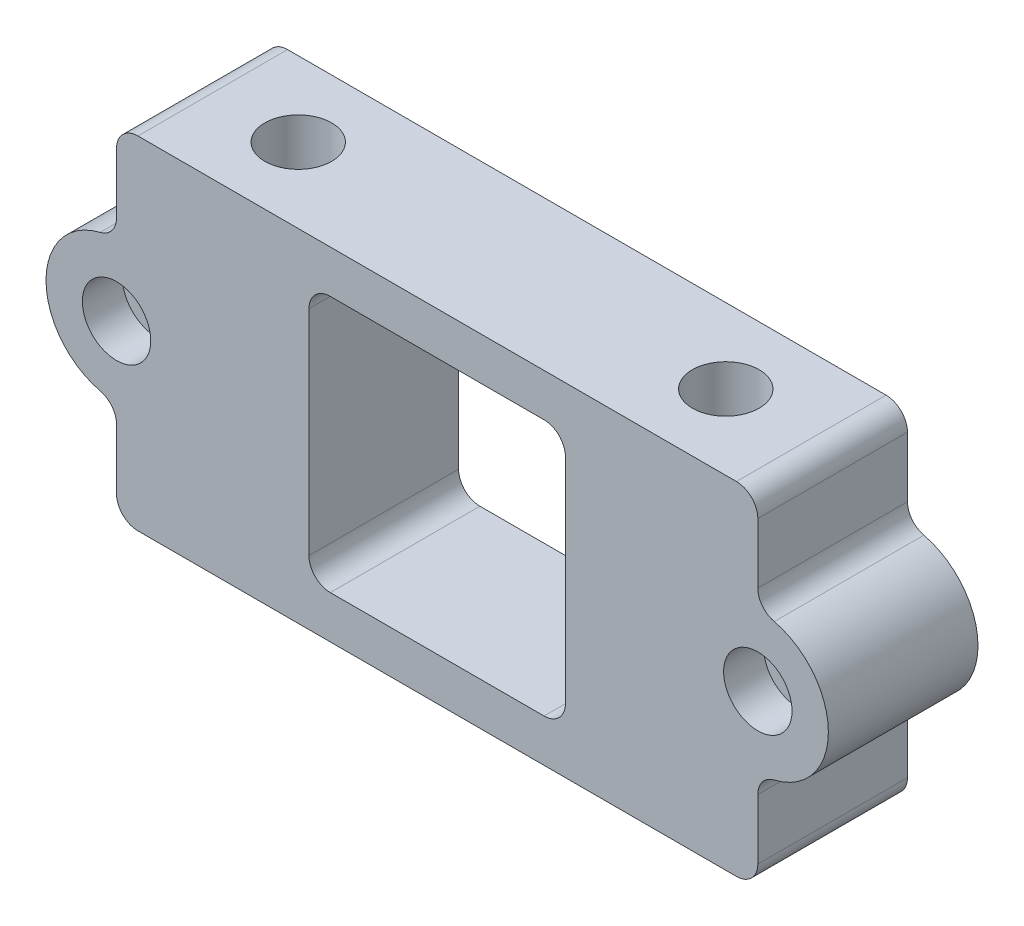
ISO-10303-21;
HEADER;
FILE_DESCRIPTION(('STEP AP214'),'2;1');
FILE_NAME('part.step','',(''),(''),'','','');
FILE_SCHEMA(('AUTOMOTIVE_DESIGN { 1 0 10303 214 1 1 1 1 }'));
ENDSEC;
DATA;
#1=APPLICATION_CONTEXT('core data for automotive mechanical design processes');
#2=APPLICATION_PROTOCOL_DEFINITION('international standard','automotive_design',2000,#1);
#3=PRODUCT_CONTEXT('',#1,'mechanical');
#4=PRODUCT('Part','Part','',(#3));
#5=PRODUCT_RELATED_PRODUCT_CATEGORY('part','',(#4));
#6=PRODUCT_DEFINITION_FORMATION('','',#4);
#7=PRODUCT_DEFINITION_CONTEXT('part definition',#1,'design');
#8=PRODUCT_DEFINITION('design','',#6,#7);
#9=PRODUCT_DEFINITION_SHAPE('','',#8);
#10=(LENGTH_UNIT() NAMED_UNIT(*) SI_UNIT(.MILLI.,.METRE.));
#11=(NAMED_UNIT(*) PLANE_ANGLE_UNIT() SI_UNIT($,.RADIAN.));
#12=(NAMED_UNIT(*) SI_UNIT($,.STERADIAN.) SOLID_ANGLE_UNIT());
#13=UNCERTAINTY_MEASURE_WITH_UNIT(LENGTH_MEASURE(1.E-05),#10,'distance_accuracy_value','');
#14=(GEOMETRIC_REPRESENTATION_CONTEXT(3) GLOBAL_UNCERTAINTY_ASSIGNED_CONTEXT((#13)) GLOBAL_UNIT_ASSIGNED_CONTEXT((#10,
#11,#12)) REPRESENTATION_CONTEXT('',''));
#15=CARTESIAN_POINT('',(0.,0.,0.));
#16=DIRECTION('',(0.,0.,1.));
#17=DIRECTION('',(1.,0.,0.));
#18=AXIS2_PLACEMENT_3D('',#15,#16,#17);
#19=CARTESIAN_POINT('',(-84.93125,0.,-17.78));
#20=DIRECTION('',(0.,0.,1.));
#21=DIRECTION('',(1.,0.,0.));
#22=AXIS2_PLACEMENT_3D('',#19,#20,#21);
#23=CYLINDRICAL_SURFACE('',#22,2.4892);
#24=CARTESIAN_POINT('',(-84.93125,0.,-17.78));
#25=DIRECTION('',(0.,0.,1.));
#26=DIRECTION('',(1.,0.,0.));
#27=AXIS2_PLACEMENT_3D('',#24,#25,#26);
#28=CIRCLE('',#27,2.4892);
#29=CARTESIAN_POINT('',(-82.44205,0.,-17.78));
#30=VERTEX_POINT('',#29);
#31=EDGE_CURVE('E437',#30,#30,#28,.T.);
#32=ORIENTED_EDGE('',*,*,#31,.F.);
#33=EDGE_LOOP('',(#32));
#34=FACE_BOUND('',#33,.T.);
#35=CARTESIAN_POINT('',(-84.93125,0.,-4.7752));
#36=DIRECTION('',(0.,0.,1.));
#37=DIRECTION('',(1.,0.,0.));
#38=AXIS2_PLACEMENT_3D('',#35,#36,#37);
#39=CIRCLE('',#38,2.4892);
#40=CARTESIAN_POINT('',(-82.44205,0.,-4.7752));
#41=VERTEX_POINT('',#40);
#42=EDGE_CURVE('E46',#41,#41,#39,.F.);
#43=ORIENTED_EDGE('',*,*,#42,.F.);
#44=EDGE_LOOP('',(#43));
#45=FACE_BOUND('',#44,.T.);
#46=ADVANCED_FACE('F42',(#34,#45),#23,.F.);
#47=CARTESIAN_POINT('',(-8.73125,0.,-17.78));
#48=DIRECTION('',(0.,0.,1.));
#49=DIRECTION('',(1.,0.,0.));
#50=AXIS2_PLACEMENT_3D('',#47,#48,#49);
#51=CYLINDRICAL_SURFACE('',#50,2.4892);
#52=CARTESIAN_POINT('',(-8.73125,0.,-17.78));
#53=DIRECTION('',(0.,0.,1.));
#54=DIRECTION('',(1.,0.,0.));
#55=AXIS2_PLACEMENT_3D('',#52,#53,#54);
#56=CIRCLE('',#55,2.4892);
#57=CARTESIAN_POINT('',(-6.24204999999999,0.,-17.78));
#58=VERTEX_POINT('',#57);
#59=EDGE_CURVE('E422',#58,#58,#56,.T.);
#60=ORIENTED_EDGE('',*,*,#59,.F.);
#61=EDGE_LOOP('',(#60));
#62=FACE_BOUND('',#61,.T.);
#63=CARTESIAN_POINT('',(-8.73125,0.,-4.7752));
#64=DIRECTION('',(0.,0.,1.));
#65=DIRECTION('',(1.,0.,0.));
#66=AXIS2_PLACEMENT_3D('',#63,#64,#65);
#67=CIRCLE('',#66,2.4892);
#68=CARTESIAN_POINT('',(-6.24204999999999,0.,-4.7752));
#69=VERTEX_POINT('',#68);
#70=EDGE_CURVE('E303',#69,#69,#67,.F.);
#71=ORIENTED_EDGE('',*,*,#70,.F.);
#72=EDGE_LOOP('',(#71));
#73=FACE_BOUND('',#72,.T.);
#74=ADVANCED_FACE('F514',(#62,#73),#51,.F.);
#75=CARTESIAN_POINT('',(-93.6625,20.32,-17.78));
#76=DIRECTION('',(0.,1.,0.));
#77=DIRECTION('',(0.,0.,1.));
#78=AXIS2_PLACEMENT_3D('',#75,#76,#77);
#79=PLANE('',#78);
#80=DIRECTION('',(-1.,0.,0.));
#81=VECTOR('',#80,1.);
#82=CARTESIAN_POINT('',(-93.6625,20.32,0.));
#83=LINE('',#82,#81);
#84=CARTESIAN_POINT('',(-11.27125,20.32,0.));
#85=VERTEX_POINT('',#84);
#86=CARTESIAN_POINT('',(-82.39125,20.32,0.));
#87=VERTEX_POINT('',#86);
#88=EDGE_CURVE('E441',#85,#87,#83,.T.);
#89=ORIENTED_EDGE('',*,*,#88,.F.);
#90=DIRECTION('',(0.,0.,1.));
#91=VECTOR('',#90,1.);
#92=CARTESIAN_POINT('',(-11.27125,20.32,-17.78));
#93=LINE('',#92,#91);
#94=CARTESIAN_POINT('',(-11.27125,20.32,-17.78));
#95=VERTEX_POINT('',#94);
#96=EDGE_CURVE('E499',#85,#95,#93,.F.);
#97=ORIENTED_EDGE('',*,*,#96,.T.);
#98=DIRECTION('',(-1.,0.,0.));
#99=VECTOR('',#98,1.);
#100=CARTESIAN_POINT('',(-93.6625,20.32,-17.78));
#101=LINE('',#100,#99);
#102=CARTESIAN_POINT('',(-82.39125,20.32,-17.78));
#103=VERTEX_POINT('',#102);
#104=EDGE_CURVE('E442',#95,#103,#101,.T.);
#105=ORIENTED_EDGE('',*,*,#104,.T.);
#106=DIRECTION('',(0.,0.,1.));
#107=VECTOR('',#106,1.);
#108=CARTESIAN_POINT('',(-82.39125,20.32,0.));
#109=LINE('',#108,#107);
#110=EDGE_CURVE('E495',#103,#87,#109,.T.);
#111=ORIENTED_EDGE('',*,*,#110,.T.);
#112=EDGE_LOOP('',(#89,#97,#105,#111));
#113=FACE_BOUND('',#112,.T.);
#114=CARTESIAN_POINT('',(-72.23125,20.32,-8.89));
#115=DIRECTION('',(0.,1.,0.));
#116=DIRECTION('',(0.,0.,1.));
#117=AXIS2_PLACEMENT_3D('',#114,#115,#116);
#118=CIRCLE('',#117,3.96874999999999);
#119=CARTESIAN_POINT('',(-72.23125,20.32,-4.92125000000001));
#120=VERTEX_POINT('',#119);
#121=EDGE_CURVE('E423',#120,#120,#118,.T.);
#122=ORIENTED_EDGE('',*,*,#121,.F.);
#123=EDGE_LOOP('',(#122));
#124=FACE_BOUND('',#123,.T.);
#125=CARTESIAN_POINT('',(-21.43125,20.32,-8.89));
#126=DIRECTION('',(0.,1.,0.));
#127=DIRECTION('',(0.,0.,1.));
#128=AXIS2_PLACEMENT_3D('',#125,#126,#127);
#129=CIRCLE('',#128,3.96875);
#130=CARTESIAN_POINT('',(-21.43125,20.32,-4.92125000000001));
#131=VERTEX_POINT('',#130);
#132=EDGE_CURVE('E342',#131,#131,#129,.T.);
#133=ORIENTED_EDGE('',*,*,#132,.F.);
#134=EDGE_LOOP('',(#133));
#135=FACE_BOUND('',#134,.T.);
#136=ADVANCED_FACE('F520',(#113,#124,#135),#79,.T.);
#137=CARTESIAN_POINT('',(-93.6625,-20.32,-17.78));
#138=DIRECTION('',(0.,-1.,0.));
#139=DIRECTION('',(0.,0.,-1.));
#140=AXIS2_PLACEMENT_3D('',#137,#138,#139);
#141=PLANE('',#140);
#142=DIRECTION('',(1.,0.,0.));
#143=VECTOR('',#142,1.);
#144=CARTESIAN_POINT('',(-93.6625,-20.32,-17.78));
#145=LINE('',#144,#143);
#146=CARTESIAN_POINT('',(-82.39125,-20.32,-17.78));
#147=VERTEX_POINT('',#146);
#148=CARTESIAN_POINT('',(-11.2712500000001,-20.32,-17.78));
#149=VERTEX_POINT('',#148);
#150=EDGE_CURVE('E446',#147,#149,#145,.T.);
#151=ORIENTED_EDGE('',*,*,#150,.T.);
#152=DIRECTION('',(0.,0.,1.));
#153=VECTOR('',#152,1.);
#154=CARTESIAN_POINT('',(-11.27125,-20.32,0.));
#155=LINE('',#154,#153);
#156=CARTESIAN_POINT('',(-11.2712500000001,-20.32,0.));
#157=VERTEX_POINT('',#156);
#158=EDGE_CURVE('E460',#149,#157,#155,.T.);
#159=ORIENTED_EDGE('',*,*,#158,.T.);
#160=DIRECTION('',(1.,0.,0.));
#161=VECTOR('',#160,1.);
#162=CARTESIAN_POINT('',(-93.6625,-20.32,0.));
#163=LINE('',#162,#161);
#164=CARTESIAN_POINT('',(-82.39125,-20.32,0.));
#165=VERTEX_POINT('',#164);
#166=EDGE_CURVE('E447',#165,#157,#163,.T.);
#167=ORIENTED_EDGE('',*,*,#166,.F.);
#168=DIRECTION('',(0.,0.,1.));
#169=VECTOR('',#168,1.);
#170=CARTESIAN_POINT('',(-82.39125,-20.32,-17.78));
#171=LINE('',#170,#169);
#172=EDGE_CURVE('E451',#165,#147,#171,.F.);
#173=ORIENTED_EDGE('',*,*,#172,.T.);
#174=EDGE_LOOP('',(#151,#159,#167,#173));
#175=FACE_BOUND('',#174,.T.);
#176=CARTESIAN_POINT('',(-72.23125,-20.32,-8.89));
#177=DIRECTION('',(0.,1.,0.));
#178=DIRECTION('',(0.,0.,1.));
#179=AXIS2_PLACEMENT_3D('',#176,#177,#178);
#180=CIRCLE('',#179,3.96874999999999);
#181=CARTESIAN_POINT('',(-72.23125,-20.32,-4.92125000000001));
#182=VERTEX_POINT('',#181);
#183=EDGE_CURVE('E418',#182,#182,#180,.T.);
#184=ORIENTED_EDGE('',*,*,#183,.T.);
#185=EDGE_LOOP('',(#184));
#186=FACE_BOUND('',#185,.T.);
#187=CARTESIAN_POINT('',(-21.43125,-20.32,-8.89));
#188=DIRECTION('',(0.,1.,0.));
#189=DIRECTION('',(0.,0.,1.));
#190=AXIS2_PLACEMENT_3D('',#187,#188,#189);
#191=CIRCLE('',#190,3.96875);
#192=CARTESIAN_POINT('',(-21.43125,-20.32,-4.92125000000001));
#193=VERTEX_POINT('',#192);
#194=EDGE_CURVE('E427',#193,#193,#191,.T.);
#195=ORIENTED_EDGE('',*,*,#194,.T.);
#196=EDGE_LOOP('',(#195));
#197=FACE_BOUND('',#196,.T.);
#198=ADVANCED_FACE('F529',(#175,#186,#197),#141,.T.);
#199=CARTESIAN_POINT('',(0.,0.,-17.78));
#200=DIRECTION('',(0.,0.,-1.));
#201=DIRECTION('',(-1.,0.,0.));
#202=AXIS2_PLACEMENT_3D('',#199,#200,#201);
#203=PLANE('',#202);
#204=CARTESIAN_POINT('',(-59.53125,-12.7,-17.78));
#205=DIRECTION('',(0.,0.,1.));
#206=DIRECTION('',(-1.,0.,0.));
#207=AXIS2_PLACEMENT_3D('',#204,#205,#206);
#208=CIRCLE('',#207,2.54);
#209=CARTESIAN_POINT('',(-62.07125,-12.7,-17.78));
#210=VERTEX_POINT('',#209);
#211=CARTESIAN_POINT('',(-59.53125,-15.24,-17.78));
#212=VERTEX_POINT('',#211);
#213=EDGE_CURVE('E208',#210,#212,#208,.T.);
#214=ORIENTED_EDGE('',*,*,#213,.T.);
#215=DIRECTION('',(1.,0.,0.));
#216=VECTOR('',#215,1.);
#217=CARTESIAN_POINT('',(-59.53125,-15.24,-17.78));
#218=LINE('',#217,#216);
#219=CARTESIAN_POINT('',(-34.13125,-15.24,-17.78));
#220=VERTEX_POINT('',#219);
#221=EDGE_CURVE('E218',#212,#220,#218,.T.);
#222=ORIENTED_EDGE('',*,*,#221,.T.);
#223=CARTESIAN_POINT('',(-34.13125,-12.7,-17.78));
#224=DIRECTION('',(0.,0.,1.));
#225=DIRECTION('',(1.,0.,0.));
#226=AXIS2_PLACEMENT_3D('',#223,#224,#225);
#227=CIRCLE('',#226,2.54);
#228=CARTESIAN_POINT('',(-31.59125,-12.7,-17.78));
#229=VERTEX_POINT('',#228);
#230=EDGE_CURVE('E60',#220,#229,#227,.T.);
#231=ORIENTED_EDGE('',*,*,#230,.T.);
#232=DIRECTION('',(0.,1.,0.));
#233=VECTOR('',#232,1.);
#234=CARTESIAN_POINT('',(-31.59125,-12.7,-17.78));
#235=LINE('',#234,#233);
#236=CARTESIAN_POINT('',(-31.59125,12.7,-17.78));
#237=VERTEX_POINT('',#236);
#238=EDGE_CURVE('E237',#229,#237,#235,.T.);
#239=ORIENTED_EDGE('',*,*,#238,.T.);
#240=CARTESIAN_POINT('',(-34.13125,12.7,-17.78));
#241=DIRECTION('',(0.,0.,1.));
#242=DIRECTION('',(-1.,0.,0.));
#243=AXIS2_PLACEMENT_3D('',#240,#241,#242);
#244=CIRCLE('',#243,2.54);
#245=CARTESIAN_POINT('',(-34.13125,15.24,-17.78));
#246=VERTEX_POINT('',#245);
#247=EDGE_CURVE('E241',#237,#246,#244,.T.);
#248=ORIENTED_EDGE('',*,*,#247,.T.);
#249=DIRECTION('',(-1.,0.,0.));
#250=VECTOR('',#249,1.);
#251=CARTESIAN_POINT('',(-59.53125,15.24,-17.78));
#252=LINE('',#251,#250);
#253=CARTESIAN_POINT('',(-59.53125,15.24,-17.78));
#254=VERTEX_POINT('',#253);
#255=EDGE_CURVE('E245',#246,#254,#252,.T.);
#256=ORIENTED_EDGE('',*,*,#255,.T.);
#257=CARTESIAN_POINT('',(-59.53125,12.7,-17.78));
#258=DIRECTION('',(0.,0.,1.));
#259=DIRECTION('',(-1.,0.,0.));
#260=AXIS2_PLACEMENT_3D('',#257,#258,#259);
#261=CIRCLE('',#260,2.54);
#262=CARTESIAN_POINT('',(-62.07125,12.7,-17.78));
#263=VERTEX_POINT('',#262);
#264=EDGE_CURVE('E249',#254,#263,#261,.T.);
#265=ORIENTED_EDGE('',*,*,#264,.T.);
#266=DIRECTION('',(0.,-1.,0.));
#267=VECTOR('',#266,1.);
#268=CARTESIAN_POINT('',(-62.07125,-12.7,-17.78));
#269=LINE('',#268,#267);
#270=EDGE_CURVE('E215',#263,#210,#269,.T.);
#271=ORIENTED_EDGE('',*,*,#270,.T.);
#272=EDGE_LOOP('',(#214,#222,#231,#239,#248,#256,#265,#271));
#273=FACE_BOUND('',#272,.T.);
#274=DIRECTION('',(0.,-1.,0.));
#275=VECTOR('',#274,1.);
#276=CARTESIAN_POINT('',(-8.73125000000001,-10.6225460224938,-17.78));
#277=LINE('',#276,#275);
#278=CARTESIAN_POINT('',(-8.73125,-10.6225460224938,-17.78));
#279=VERTEX_POINT('',#278);
#280=CARTESIAN_POINT('',(-8.73125000000004,-17.78,-17.78));
#281=VERTEX_POINT('',#280);
#282=EDGE_CURVE('E334',#279,#281,#277,.T.);
#283=ORIENTED_EDGE('',*,*,#282,.T.);
#284=CARTESIAN_POINT('',(-11.27125,-17.78,-17.78));
#285=DIRECTION('',(0.,0.,-1.));
#286=DIRECTION('',(-1.,0.,0.));
#287=AXIS2_PLACEMENT_3D('',#284,#285,#286);
#288=CIRCLE('',#287,2.54);
#289=EDGE_CURVE('E488',#281,#149,#288,.T.);
#290=ORIENTED_EDGE('',*,*,#289,.T.);
#291=ORIENTED_EDGE('',*,*,#150,.F.);
#292=CARTESIAN_POINT('',(-82.39125,-17.78,-17.78));
#293=DIRECTION('',(0.,0.,-1.));
#294=DIRECTION('',(-1.,0.,0.));
#295=AXIS2_PLACEMENT_3D('',#292,#293,#294);
#296=CIRCLE('',#295,2.54);
#297=CARTESIAN_POINT('',(-84.93125,-17.78,-17.78));
#298=VERTEX_POINT('',#297);
#299=EDGE_CURVE('E479',#147,#298,#296,.T.);
#300=ORIENTED_EDGE('',*,*,#299,.T.);
#301=DIRECTION('',(0.,1.,0.));
#302=VECTOR('',#301,1.);
#303=CARTESIAN_POINT('',(-84.93125,-10.6225460224939,-17.78));
#304=LINE('',#303,#302);
#305=CARTESIAN_POINT('',(-84.93125,-10.6225460224939,-17.78));
#306=VERTEX_POINT('',#305);
#307=EDGE_CURVE('E319',#298,#306,#304,.T.);
#308=ORIENTED_EDGE('',*,*,#307,.T.);
#309=CARTESIAN_POINT('',(-87.47125,-10.6225460224939,-17.78));
#310=DIRECTION('',(0.,0.,-1.));
#311=DIRECTION('',(-1.,0.,0.));
#312=AXIS2_PLACEMENT_3D('',#309,#310,#311);
#313=CIRCLE('',#312,2.54000000000001);
#314=CARTESIAN_POINT('',(-86.8805523255814,-8.152186482379,-17.78));
#315=VERTEX_POINT('',#314);
#316=EDGE_CURVE('E354',#306,#315,#313,.F.);
#317=ORIENTED_EDGE('',*,*,#316,.T.);
#318=CARTESIAN_POINT('',(-84.93125,0.,-17.78));
#319=DIRECTION('',(0.,0.,-1.));
#320=DIRECTION('',(-1.,0.,0.));
#321=AXIS2_PLACEMENT_3D('',#318,#319,#320);
#322=CIRCLE('',#321,8.382);
#323=CARTESIAN_POINT('',(-86.8805523255814,8.152186482379,-17.78));
#324=VERTEX_POINT('',#323);
#325=EDGE_CURVE('E349',#315,#324,#322,.T.);
#326=ORIENTED_EDGE('',*,*,#325,.T.);
#327=CARTESIAN_POINT('',(-87.47125,10.6225460224939,-17.78));
#328=DIRECTION('',(0.,0.,-1.));
#329=DIRECTION('',(-1.,0.,0.));
#330=AXIS2_PLACEMENT_3D('',#327,#328,#329);
#331=CIRCLE('',#330,2.54000000000001);
#332=CARTESIAN_POINT('',(-84.93125,10.6225460224939,-17.78));
#333=VERTEX_POINT('',#332);
#334=EDGE_CURVE('E344',#324,#333,#331,.F.);
#335=ORIENTED_EDGE('',*,*,#334,.T.);
#336=DIRECTION('',(0.,1.,0.));
#337=VECTOR('',#336,1.);
#338=CARTESIAN_POINT('',(-84.93125,10.6225460224939,-17.78));
#339=LINE('',#338,#337);
#340=CARTESIAN_POINT('',(-84.93125,17.78,-17.78));
#341=VERTEX_POINT('',#340);
#342=EDGE_CURVE('E338',#333,#341,#339,.T.);
#343=ORIENTED_EDGE('',*,*,#342,.T.);
#344=CARTESIAN_POINT('',(-82.39125,17.78,-17.78));
#345=DIRECTION('',(0.,0.,-1.));
#346=DIRECTION('',(-1.,0.,0.));
#347=AXIS2_PLACEMENT_3D('',#344,#345,#346);
#348=CIRCLE('',#347,2.54);
#349=EDGE_CURVE('E482',#341,#103,#348,.T.);
#350=ORIENTED_EDGE('',*,*,#349,.T.);
#351=ORIENTED_EDGE('',*,*,#104,.F.);
#352=CARTESIAN_POINT('',(-11.27125,17.78,-17.78));
#353=DIRECTION('',(0.,0.,-1.));
#354=DIRECTION('',(-1.,0.,0.));
#355=AXIS2_PLACEMENT_3D('',#352,#353,#354);
#356=CIRCLE('',#355,2.54);
#357=CARTESIAN_POINT('',(-8.73124999999999,17.78,-17.78));
#358=VERTEX_POINT('',#357);
#359=EDGE_CURVE('E485',#95,#358,#356,.T.);
#360=ORIENTED_EDGE('',*,*,#359,.T.);
#361=DIRECTION('',(0.,-1.,0.));
#362=VECTOR('',#361,1.);
#363=CARTESIAN_POINT('',(-8.73124999999998,10.6225460224939,-17.78));
#364=LINE('',#363,#362);
#365=CARTESIAN_POINT('',(-8.73124999999998,10.6225460224939,-17.78));
#366=VERTEX_POINT('',#365);
#367=EDGE_CURVE('E372',#358,#366,#364,.T.);
#368=ORIENTED_EDGE('',*,*,#367,.T.);
#369=CARTESIAN_POINT('',(-6.19124999999997,10.6225460224939,-17.78));
#370=DIRECTION('',(0.,0.,-1.));
#371=DIRECTION('',(-1.,0.,0.));
#372=AXIS2_PLACEMENT_3D('',#369,#370,#371);
#373=CIRCLE('',#372,2.54000000000001);
#374=CARTESIAN_POINT('',(-6.78194767441858,8.15218648237901,-17.78));
#375=VERTEX_POINT('',#374);
#376=EDGE_CURVE('E401',#366,#375,#373,.F.);
#377=ORIENTED_EDGE('',*,*,#376,.T.);
#378=CARTESIAN_POINT('',(-8.73125,0.,-17.78));
#379=DIRECTION('',(0.,0.,-1.));
#380=DIRECTION('',(-1.,0.,0.));
#381=AXIS2_PLACEMENT_3D('',#378,#379,#380);
#382=CIRCLE('',#381,8.382);
#383=CARTESIAN_POINT('',(-6.7819476744186,-8.152186482379,-17.78));
#384=VERTEX_POINT('',#383);
#385=EDGE_CURVE('E396',#375,#384,#382,.T.);
#386=ORIENTED_EDGE('',*,*,#385,.T.);
#387=CARTESIAN_POINT('',(-6.19125,-10.6225460224938,-17.78));
#388=DIRECTION('',(0.,0.,-1.));
#389=DIRECTION('',(-1.,0.,0.));
#390=AXIS2_PLACEMENT_3D('',#387,#388,#389);
#391=CIRCLE('',#390,2.54000000000001);
#392=EDGE_CURVE('E391',#384,#279,#391,.F.);
#393=ORIENTED_EDGE('',*,*,#392,.T.);
#394=EDGE_LOOP('',(#283,#290,#291,#300,#308,#317,#326,#335,#343,#350,#351,#360,#368,#377,#386,#393));
#395=FACE_BOUND('',#394,.T.);
#396=ORIENTED_EDGE('',*,*,#59,.T.);
#397=EDGE_LOOP('',(#396));
#398=FACE_BOUND('',#397,.T.);
#399=ORIENTED_EDGE('',*,*,#31,.T.);
#400=EDGE_LOOP('',(#399));
#401=FACE_BOUND('',#400,.T.);
#402=ADVANCED_FACE('F223',(#273,#395,#398,#401),#203,.T.);
#403=CARTESIAN_POINT('',(0.,0.,0.));
#404=DIRECTION('',(0.,0.,-1.));
#405=DIRECTION('',(-1.,0.,0.));
#406=AXIS2_PLACEMENT_3D('',#403,#404,#405);
#407=PLANE('',#406);
#408=DIRECTION('',(1.,0.,0.));
#409=VECTOR('',#408,1.);
#410=CARTESIAN_POINT('',(-59.53125,-15.24,0.));
#411=LINE('',#410,#409);
#412=CARTESIAN_POINT('',(-59.53125,-15.24,0.));
#413=VERTEX_POINT('',#412);
#414=CARTESIAN_POINT('',(-34.13125,-15.24,0.));
#415=VERTEX_POINT('',#414);
#416=EDGE_CURVE('E256',#413,#415,#411,.T.);
#417=ORIENTED_EDGE('',*,*,#416,.F.);
#418=CARTESIAN_POINT('',(-59.53125,-12.7,0.));
#419=DIRECTION('',(0.,0.,1.));
#420=DIRECTION('',(-1.,0.,0.));
#421=AXIS2_PLACEMENT_3D('',#418,#419,#420);
#422=CIRCLE('',#421,2.54);
#423=CARTESIAN_POINT('',(-62.07125,-12.7,0.));
#424=VERTEX_POINT('',#423);
#425=EDGE_CURVE('E68',#424,#413,#422,.T.);
#426=ORIENTED_EDGE('',*,*,#425,.F.);
#427=DIRECTION('',(0.,-1.,0.));
#428=VECTOR('',#427,1.);
#429=CARTESIAN_POINT('',(-62.07125,-12.7,0.));
#430=LINE('',#429,#428);
#431=CARTESIAN_POINT('',(-62.07125,12.7,0.));
#432=VERTEX_POINT('',#431);
#433=EDGE_CURVE('E228',#432,#424,#430,.T.);
#434=ORIENTED_EDGE('',*,*,#433,.F.);
#435=CARTESIAN_POINT('',(-59.53125,12.7,0.));
#436=DIRECTION('',(0.,0.,1.));
#437=DIRECTION('',(-1.,0.,0.));
#438=AXIS2_PLACEMENT_3D('',#435,#436,#437);
#439=CIRCLE('',#438,2.54);
#440=CARTESIAN_POINT('',(-59.53125,15.24,0.));
#441=VERTEX_POINT('',#440);
#442=EDGE_CURVE('E232',#441,#432,#439,.T.);
#443=ORIENTED_EDGE('',*,*,#442,.F.);
#444=DIRECTION('',(-1.,0.,0.));
#445=VECTOR('',#444,1.);
#446=CARTESIAN_POINT('',(-59.53125,15.24,0.));
#447=LINE('',#446,#445);
#448=CARTESIAN_POINT('',(-34.13125,15.24,0.));
#449=VERTEX_POINT('',#448);
#450=EDGE_CURVE('E271',#449,#441,#447,.T.);
#451=ORIENTED_EDGE('',*,*,#450,.F.);
#452=CARTESIAN_POINT('',(-34.13125,12.7,0.));
#453=DIRECTION('',(0.,0.,1.));
#454=DIRECTION('',(-1.,0.,0.));
#455=AXIS2_PLACEMENT_3D('',#452,#453,#454);
#456=CIRCLE('',#455,2.54);
#457=CARTESIAN_POINT('',(-31.59125,12.7,0.));
#458=VERTEX_POINT('',#457);
#459=EDGE_CURVE('E267',#458,#449,#456,.T.);
#460=ORIENTED_EDGE('',*,*,#459,.F.);
#461=DIRECTION('',(0.,1.,0.));
#462=VECTOR('',#461,1.);
#463=CARTESIAN_POINT('',(-31.59125,-12.7,0.));
#464=LINE('',#463,#462);
#465=CARTESIAN_POINT('',(-31.59125,-12.7,0.));
#466=VERTEX_POINT('',#465);
#467=EDGE_CURVE('E263',#466,#458,#464,.T.);
#468=ORIENTED_EDGE('',*,*,#467,.F.);
#469=CARTESIAN_POINT('',(-34.13125,-12.7,0.));
#470=DIRECTION('',(0.,0.,1.));
#471=DIRECTION('',(1.,0.,0.));
#472=AXIS2_PLACEMENT_3D('',#469,#470,#471);
#473=CIRCLE('',#472,2.54);
#474=EDGE_CURVE('E259',#415,#466,#473,.T.);
#475=ORIENTED_EDGE('',*,*,#474,.F.);
#476=EDGE_LOOP('',(#417,#426,#434,#443,#451,#460,#468,#475));
#477=FACE_BOUND('',#476,.T.);
#478=CARTESIAN_POINT('',(-8.73125,0.,0.));
#479=DIRECTION('',(0.,0.,1.));
#480=DIRECTION('',(1.,0.,0.));
#481=AXIS2_PLACEMENT_3D('',#478,#479,#480);
#482=CIRCLE('',#481,4.06400000000002);
#483=CARTESIAN_POINT('',(-4.66724999999998,0.,0.));
#484=VERTEX_POINT('',#483);
#485=EDGE_CURVE('E304',#484,#484,#482,.T.);
#486=ORIENTED_EDGE('',*,*,#485,.F.);
#487=EDGE_LOOP('',(#486));
#488=FACE_BOUND('',#487,.T.);
#489=CARTESIAN_POINT('',(-84.93125,0.,0.));
#490=DIRECTION('',(0.,0.,1.));
#491=DIRECTION('',(1.,0.,0.));
#492=AXIS2_PLACEMENT_3D('',#489,#490,#491);
#493=CIRCLE('',#492,4.06400000000002);
#494=CARTESIAN_POINT('',(-80.86725,0.,0.));
#495=VERTEX_POINT('',#494);
#496=EDGE_CURVE('E281',#495,#495,#493,.T.);
#497=ORIENTED_EDGE('',*,*,#496,.F.);
#498=EDGE_LOOP('',(#497));
#499=FACE_BOUND('',#498,.T.);
#500=ORIENTED_EDGE('',*,*,#166,.T.);
#501=CARTESIAN_POINT('',(-11.27125,-17.78,0.));
#502=DIRECTION('',(0.,0.,-1.));
#503=DIRECTION('',(-1.,0.,0.));
#504=AXIS2_PLACEMENT_3D('',#501,#502,#503);
#505=CIRCLE('',#504,2.54);
#506=CARTESIAN_POINT('',(-8.73125000000004,-17.78,0.));
#507=VERTEX_POINT('',#506);
#508=EDGE_CURVE('E473',#157,#507,#505,.F.);
#509=ORIENTED_EDGE('',*,*,#508,.T.);
#510=DIRECTION('',(0.,-1.,0.));
#511=VECTOR('',#510,1.);
#512=CARTESIAN_POINT('',(-8.73125000000001,-10.6225460224938,0.));
#513=LINE('',#512,#511);
#514=CARTESIAN_POINT('',(-8.73125000000001,-10.6225460224938,0.));
#515=VERTEX_POINT('',#514);
#516=EDGE_CURVE('E368',#515,#507,#513,.T.);
#517=ORIENTED_EDGE('',*,*,#516,.F.);
#518=CARTESIAN_POINT('',(-6.19125,-10.6225460224938,0.));
#519=DIRECTION('',(0.,0.,1.));
#520=DIRECTION('',(-1.,0.,0.));
#521=AXIS2_PLACEMENT_3D('',#518,#519,#520);
#522=CIRCLE('',#521,2.54000000000001);
#523=CARTESIAN_POINT('',(-6.7819476744186,-8.152186482379,0.));
#524=VERTEX_POINT('',#523);
#525=EDGE_CURVE('E373',#524,#515,#522,.T.);
#526=ORIENTED_EDGE('',*,*,#525,.F.);
#527=CARTESIAN_POINT('',(-8.73125,0.,0.));
#528=DIRECTION('',(0.,0.,-1.));
#529=DIRECTION('',(-1.,0.,0.));
#530=AXIS2_PLACEMENT_3D('',#527,#528,#529);
#531=CIRCLE('',#530,8.382);
#532=CARTESIAN_POINT('',(-6.78194767441858,8.15218648237901,0.));
#533=VERTEX_POINT('',#532);
#534=EDGE_CURVE('E376',#533,#524,#531,.T.);
#535=ORIENTED_EDGE('',*,*,#534,.F.);
#536=CARTESIAN_POINT('',(-6.19124999999997,10.6225460224939,0.));
#537=DIRECTION('',(0.,0.,1.));
#538=DIRECTION('',(1.,0.,0.));
#539=AXIS2_PLACEMENT_3D('',#536,#537,#538);
#540=CIRCLE('',#539,2.54000000000001);
#541=CARTESIAN_POINT('',(-8.73124999999998,10.6225460224939,0.));
#542=VERTEX_POINT('',#541);
#543=EDGE_CURVE('E380',#542,#533,#540,.T.);
#544=ORIENTED_EDGE('',*,*,#543,.F.);
#545=DIRECTION('',(0.,-1.,0.));
#546=VECTOR('',#545,1.);
#547=CARTESIAN_POINT('',(-8.73124999999998,10.6225460224939,0.));
#548=LINE('',#547,#546);
#549=CARTESIAN_POINT('',(-8.73124999999999,17.78,0.));
#550=VERTEX_POINT('',#549);
#551=EDGE_CURVE('E384',#550,#542,#548,.T.);
#552=ORIENTED_EDGE('',*,*,#551,.F.);
#553=CARTESIAN_POINT('',(-11.27125,17.78,0.));
#554=DIRECTION('',(0.,0.,-1.));
#555=DIRECTION('',(-1.,0.,0.));
#556=AXIS2_PLACEMENT_3D('',#553,#554,#555);
#557=CIRCLE('',#556,2.54);
#558=EDGE_CURVE('E470',#550,#85,#557,.F.);
#559=ORIENTED_EDGE('',*,*,#558,.T.);
#560=ORIENTED_EDGE('',*,*,#88,.T.);
#561=CARTESIAN_POINT('',(-82.39125,17.78,0.));
#562=DIRECTION('',(0.,0.,-1.));
#563=DIRECTION('',(-1.,0.,0.));
#564=AXIS2_PLACEMENT_3D('',#561,#562,#563);
#565=CIRCLE('',#564,2.54);
#566=CARTESIAN_POINT('',(-84.93125,17.78,0.));
#567=VERTEX_POINT('',#566);
#568=EDGE_CURVE('E467',#87,#567,#565,.F.);
#569=ORIENTED_EDGE('',*,*,#568,.T.);
#570=DIRECTION('',(0.,1.,0.));
#571=VECTOR('',#570,1.);
#572=CARTESIAN_POINT('',(-84.93125,10.6225460224939,0.));
#573=LINE('',#572,#571);
#574=CARTESIAN_POINT('',(-84.93125,10.6225460224939,0.));
#575=VERTEX_POINT('',#574);
#576=EDGE_CURVE('E315',#575,#567,#573,.T.);
#577=ORIENTED_EDGE('',*,*,#576,.F.);
#578=CARTESIAN_POINT('',(-87.47125,10.6225460224939,0.));
#579=DIRECTION('',(0.,0.,1.));
#580=DIRECTION('',(-1.,0.,0.));
#581=AXIS2_PLACEMENT_3D('',#578,#579,#580);
#582=CIRCLE('',#581,2.54000000000001);
#583=CARTESIAN_POINT('',(-86.8805523255814,8.152186482379,0.));
#584=VERTEX_POINT('',#583);
#585=EDGE_CURVE('E320',#584,#575,#582,.T.);
#586=ORIENTED_EDGE('',*,*,#585,.F.);
#587=CARTESIAN_POINT('',(-84.93125,0.,0.));
#588=DIRECTION('',(0.,0.,-1.));
#589=DIRECTION('',(1.,0.,0.));
#590=AXIS2_PLACEMENT_3D('',#587,#588,#589);
#591=CIRCLE('',#590,8.382);
#592=CARTESIAN_POINT('',(-86.8805523255814,-8.152186482379,0.));
#593=VERTEX_POINT('',#592);
#594=EDGE_CURVE('E323',#593,#584,#591,.T.);
#595=ORIENTED_EDGE('',*,*,#594,.F.);
#596=CARTESIAN_POINT('',(-87.47125,-10.6225460224939,0.));
#597=DIRECTION('',(0.,0.,1.));
#598=DIRECTION('',(1.,0.,0.));
#599=AXIS2_PLACEMENT_3D('',#596,#597,#598);
#600=CIRCLE('',#599,2.54000000000001);
#601=CARTESIAN_POINT('',(-84.93125,-10.6225460224939,0.));
#602=VERTEX_POINT('',#601);
#603=EDGE_CURVE('E327',#602,#593,#600,.T.);
#604=ORIENTED_EDGE('',*,*,#603,.F.);
#605=DIRECTION('',(0.,1.,0.));
#606=VECTOR('',#605,1.);
#607=CARTESIAN_POINT('',(-84.93125,-10.6225460224939,0.));
#608=LINE('',#607,#606);
#609=CARTESIAN_POINT('',(-84.93125,-17.78,0.));
#610=VERTEX_POINT('',#609);
#611=EDGE_CURVE('E331',#610,#602,#608,.T.);
#612=ORIENTED_EDGE('',*,*,#611,.F.);
#613=CARTESIAN_POINT('',(-82.39125,-17.78,0.));
#614=DIRECTION('',(0.,0.,-1.));
#615=DIRECTION('',(-1.,0.,0.));
#616=AXIS2_PLACEMENT_3D('',#613,#614,#615);
#617=CIRCLE('',#616,2.54);
#618=EDGE_CURVE('E464',#610,#165,#617,.F.);
#619=ORIENTED_EDGE('',*,*,#618,.T.);
#620=EDGE_LOOP('',(#500,#509,#517,#526,#535,#544,#552,#559,#560,#569,#577,#586,#595,#604,#612,#619));
#621=FACE_BOUND('',#620,.T.);
#622=ADVANCED_FACE('F528',(#477,#488,#499,#621),#407,.F.);
#623=CARTESIAN_POINT('',(-21.43125,-20.32,-8.89));
#624=DIRECTION('',(0.,1.,0.));
#625=DIRECTION('',(0.,0.,1.));
#626=AXIS2_PLACEMENT_3D('',#623,#624,#625);
#627=CYLINDRICAL_SURFACE('',#626,3.96875);
#628=ORIENTED_EDGE('',*,*,#194,.F.);
#629=EDGE_LOOP('',(#628));
#630=FACE_BOUND('',#629,.T.);
#631=ORIENTED_EDGE('',*,*,#132,.T.);
#632=EDGE_LOOP('',(#631));
#633=FACE_BOUND('',#632,.T.);
#634=ADVANCED_FACE('F532',(#630,#633),#627,.F.);
#635=CARTESIAN_POINT('',(-72.23125,-20.32,-8.89));
#636=DIRECTION('',(0.,1.,0.));
#637=DIRECTION('',(0.,0.,1.));
#638=AXIS2_PLACEMENT_3D('',#635,#636,#637);
#639=CYLINDRICAL_SURFACE('',#638,3.96874999999999);
#640=ORIENTED_EDGE('',*,*,#183,.F.);
#641=EDGE_LOOP('',(#640));
#642=FACE_BOUND('',#641,.T.);
#643=ORIENTED_EDGE('',*,*,#121,.T.);
#644=EDGE_LOOP('',(#643));
#645=FACE_BOUND('',#644,.T.);
#646=ADVANCED_FACE('F643',(#642,#645),#639,.F.);
#647=CARTESIAN_POINT('',(-8.73124999999998,10.6225460224939,-59.3473468790409));
#648=DIRECTION('',(-1.,0.,0.));
#649=DIRECTION('',(0.,-1.,0.));
#650=AXIS2_PLACEMENT_3D('',#647,#648,#649);
#651=PLANE('',#650);
#652=ORIENTED_EDGE('',*,*,#367,.F.);
#653=DIRECTION('',(0.,0.,1.));
#654=VECTOR('',#653,1.);
#655=CARTESIAN_POINT('',(-8.73124999999999,17.78,0.));
#656=LINE('',#655,#654);
#657=EDGE_CURVE('E491',#358,#550,#656,.T.);
#658=ORIENTED_EDGE('',*,*,#657,.T.);
#659=ORIENTED_EDGE('',*,*,#551,.T.);
#660=DIRECTION('',(0.,0.,1.));
#661=VECTOR('',#660,1.);
#662=CARTESIAN_POINT('',(-8.73124999999998,10.6225460224939,-59.3473468790409));
#663=LINE('',#662,#661);
#664=EDGE_CURVE('E405',#366,#542,#663,.T.);
#665=ORIENTED_EDGE('',*,*,#664,.F.);
#666=EDGE_LOOP('',(#652,#658,#659,#665));
#667=FACE_BOUND('',#666,.T.);
#668=ADVANCED_FACE('F570',(#667),#651,.F.);
#669=CARTESIAN_POINT('',(-6.19124999999997,10.6225460224939,-59.3473468790409));
#670=DIRECTION('',(0.,0.,1.));
#671=DIRECTION('',(1.,0.,0.));
#672=AXIS2_PLACEMENT_3D('',#669,#670,#671);
#673=CYLINDRICAL_SURFACE('',#672,2.54000000000001);
#674=ORIENTED_EDGE('',*,*,#664,.T.);
#675=ORIENTED_EDGE('',*,*,#543,.T.);
#676=DIRECTION('',(0.,0.,1.));
#677=VECTOR('',#676,1.);
#678=CARTESIAN_POINT('',(-6.78194767441858,8.15218648237901,-59.3473468790409));
#679=LINE('',#678,#677);
#680=EDGE_CURVE('E400',#375,#533,#679,.T.);
#681=ORIENTED_EDGE('',*,*,#680,.F.);
#682=ORIENTED_EDGE('',*,*,#376,.F.);
#683=EDGE_LOOP('',(#674,#675,#681,#682));
#684=FACE_BOUND('',#683,.T.);
#685=ADVANCED_FACE('F574',(#684),#673,.F.);
#686=CARTESIAN_POINT('',(-8.73125,0.,-59.3473468790409));
#687=DIRECTION('',(0.,0.,1.));
#688=DIRECTION('',(1.,0.,0.));
#689=AXIS2_PLACEMENT_3D('',#686,#687,#688);
#690=CYLINDRICAL_SURFACE('',#689,8.382);
#691=ORIENTED_EDGE('',*,*,#680,.T.);
#692=ORIENTED_EDGE('',*,*,#534,.T.);
#693=DIRECTION('',(0.,0.,1.));
#694=VECTOR('',#693,1.);
#695=CARTESIAN_POINT('',(-6.7819476744186,-8.152186482379,-59.3473468790409));
#696=LINE('',#695,#694);
#697=EDGE_CURVE('E395',#384,#524,#696,.T.);
#698=ORIENTED_EDGE('',*,*,#697,.F.);
#699=ORIENTED_EDGE('',*,*,#385,.F.);
#700=EDGE_LOOP('',(#691,#692,#698,#699));
#701=FACE_BOUND('',#700,.T.);
#702=ADVANCED_FACE('F582',(#701),#690,.T.);
#703=CARTESIAN_POINT('',(-6.19125,-10.6225460224938,-59.3473468790409));
#704=DIRECTION('',(0.,0.,1.));
#705=DIRECTION('',(1.,0.,0.));
#706=AXIS2_PLACEMENT_3D('',#703,#704,#705);
#707=CYLINDRICAL_SURFACE('',#706,2.54000000000001);
#708=ORIENTED_EDGE('',*,*,#697,.T.);
#709=ORIENTED_EDGE('',*,*,#525,.T.);
#710=DIRECTION('',(0.,0.,1.));
#711=VECTOR('',#710,1.);
#712=CARTESIAN_POINT('',(-8.73125,-10.6225460224938,-59.3473468790409));
#713=LINE('',#712,#711);
#714=EDGE_CURVE('E390',#279,#515,#713,.T.);
#715=ORIENTED_EDGE('',*,*,#714,.F.);
#716=ORIENTED_EDGE('',*,*,#392,.F.);
#717=EDGE_LOOP('',(#708,#709,#715,#716));
#718=FACE_BOUND('',#717,.T.);
#719=ADVANCED_FACE('F586',(#718),#707,.F.);
#720=CARTESIAN_POINT('',(-8.73125000000001,-10.6225460224938,-59.3473468790409));
#721=DIRECTION('',(-1.,0.,0.));
#722=DIRECTION('',(0.,-1.,0.));
#723=AXIS2_PLACEMENT_3D('',#720,#721,#722);
#724=PLANE('',#723);
#725=ORIENTED_EDGE('',*,*,#516,.T.);
#726=DIRECTION('',(0.,0.,1.));
#727=VECTOR('',#726,1.);
#728=CARTESIAN_POINT('',(-8.73125000000004,-17.78,-17.78));
#729=LINE('',#728,#727);
#730=EDGE_CURVE('E476',#507,#281,#729,.F.);
#731=ORIENTED_EDGE('',*,*,#730,.T.);
#732=ORIENTED_EDGE('',*,*,#282,.F.);
#733=ORIENTED_EDGE('',*,*,#714,.T.);
#734=EDGE_LOOP('',(#725,#731,#732,#733));
#735=FACE_BOUND('',#734,.T.);
#736=ADVANCED_FACE('F588',(#735),#724,.F.);
#737=CARTESIAN_POINT('',(-84.93125,-10.6225460224939,-59.3473468790409));
#738=DIRECTION('',(1.,0.,0.));
#739=DIRECTION('',(0.,1.,0.));
#740=AXIS2_PLACEMENT_3D('',#737,#738,#739);
#741=PLANE('',#740);
#742=ORIENTED_EDGE('',*,*,#307,.F.);
#743=DIRECTION('',(0.,0.,1.));
#744=VECTOR('',#743,1.);
#745=CARTESIAN_POINT('',(-84.93125,-17.78,0.));
#746=LINE('',#745,#744);
#747=EDGE_CURVE('E11',#298,#610,#746,.T.);
#748=ORIENTED_EDGE('',*,*,#747,.T.);
#749=ORIENTED_EDGE('',*,*,#611,.T.);
#750=DIRECTION('',(0.,0.,1.));
#751=VECTOR('',#750,1.);
#752=CARTESIAN_POINT('',(-84.93125,-10.6225460224939,-59.3473468790409));
#753=LINE('',#752,#751);
#754=EDGE_CURVE('E337',#306,#602,#753,.T.);
#755=ORIENTED_EDGE('',*,*,#754,.F.);
#756=EDGE_LOOP('',(#742,#748,#749,#755));
#757=FACE_BOUND('',#756,.T.);
#758=ADVANCED_FACE('F600',(#757),#741,.F.);
#759=CARTESIAN_POINT('',(-87.47125,-10.6225460224939,-59.3473468790409));
#760=DIRECTION('',(0.,0.,1.));
#761=DIRECTION('',(1.,0.,0.));
#762=AXIS2_PLACEMENT_3D('',#759,#760,#761);
#763=CYLINDRICAL_SURFACE('',#762,2.54000000000001);
#764=ORIENTED_EDGE('',*,*,#754,.T.);
#765=ORIENTED_EDGE('',*,*,#603,.T.);
#766=DIRECTION('',(0.,0.,1.));
#767=VECTOR('',#766,1.);
#768=CARTESIAN_POINT('',(-86.8805523255814,-8.152186482379,-59.3473468790409));
#769=LINE('',#768,#767);
#770=EDGE_CURVE('E353',#315,#593,#769,.T.);
#771=ORIENTED_EDGE('',*,*,#770,.F.);
#772=ORIENTED_EDGE('',*,*,#316,.F.);
#773=EDGE_LOOP('',(#764,#765,#771,#772));
#774=FACE_BOUND('',#773,.T.);
#775=ADVANCED_FACE('F607',(#774),#763,.F.);
#776=CARTESIAN_POINT('',(-84.93125,0.,-59.3473468790409));
#777=DIRECTION('',(0.,0.,1.));
#778=DIRECTION('',(1.,0.,0.));
#779=AXIS2_PLACEMENT_3D('',#776,#777,#778);
#780=CYLINDRICAL_SURFACE('',#779,8.382);
#781=ORIENTED_EDGE('',*,*,#770,.T.);
#782=ORIENTED_EDGE('',*,*,#594,.T.);
#783=DIRECTION('',(0.,0.,1.));
#784=VECTOR('',#783,1.);
#785=CARTESIAN_POINT('',(-86.8805523255814,8.152186482379,-59.3473468790409));
#786=LINE('',#785,#784);
#787=EDGE_CURVE('E348',#324,#584,#786,.T.);
#788=ORIENTED_EDGE('',*,*,#787,.F.);
#789=ORIENTED_EDGE('',*,*,#325,.F.);
#790=EDGE_LOOP('',(#781,#782,#788,#789));
#791=FACE_BOUND('',#790,.T.);
#792=ADVANCED_FACE('F611',(#791),#780,.T.);
#793=CARTESIAN_POINT('',(-87.47125,10.6225460224939,-59.3473468790409));
#794=DIRECTION('',(0.,0.,1.));
#795=DIRECTION('',(1.,0.,0.));
#796=AXIS2_PLACEMENT_3D('',#793,#794,#795);
#797=CYLINDRICAL_SURFACE('',#796,2.54000000000001);
#798=ORIENTED_EDGE('',*,*,#787,.T.);
#799=ORIENTED_EDGE('',*,*,#585,.T.);
#800=DIRECTION('',(0.,0.,1.));
#801=VECTOR('',#800,1.);
#802=CARTESIAN_POINT('',(-84.93125,10.6225460224939,-59.3473468790409));
#803=LINE('',#802,#801);
#804=EDGE_CURVE('E343',#333,#575,#803,.T.);
#805=ORIENTED_EDGE('',*,*,#804,.F.);
#806=ORIENTED_EDGE('',*,*,#334,.F.);
#807=EDGE_LOOP('',(#798,#799,#805,#806));
#808=FACE_BOUND('',#807,.T.);
#809=ADVANCED_FACE('F613',(#808),#797,.F.);
#810=CARTESIAN_POINT('',(-84.93125,10.6225460224939,-59.3473468790409));
#811=DIRECTION('',(1.,0.,0.));
#812=DIRECTION('',(0.,1.,0.));
#813=AXIS2_PLACEMENT_3D('',#810,#811,#812);
#814=PLANE('',#813);
#815=ORIENTED_EDGE('',*,*,#576,.T.);
#816=DIRECTION('',(0.,0.,1.));
#817=VECTOR('',#816,1.);
#818=CARTESIAN_POINT('',(-84.93125,17.78,-17.78));
#819=LINE('',#818,#817);
#820=EDGE_CURVE('E52',#567,#341,#819,.F.);
#821=ORIENTED_EDGE('',*,*,#820,.T.);
#822=ORIENTED_EDGE('',*,*,#342,.F.);
#823=ORIENTED_EDGE('',*,*,#804,.T.);
#824=EDGE_LOOP('',(#815,#821,#822,#823));
#825=FACE_BOUND('',#824,.T.);
#826=ADVANCED_FACE('F544',(#825),#814,.F.);
#827=CARTESIAN_POINT('',(-11.27125,-17.78,-17.78));
#828=DIRECTION('',(0.,0.,-1.));
#829=DIRECTION('',(-1.,0.,0.));
#830=AXIS2_PLACEMENT_3D('',#827,#828,#829);
#831=CYLINDRICAL_SURFACE('',#830,2.54);
#832=ORIENTED_EDGE('',*,*,#289,.F.);
#833=ORIENTED_EDGE('',*,*,#730,.F.);
#834=ORIENTED_EDGE('',*,*,#508,.F.);
#835=ORIENTED_EDGE('',*,*,#158,.F.);
#836=EDGE_LOOP('',(#832,#833,#834,#835));
#837=FACE_BOUND('',#836,.T.);
#838=ADVANCED_FACE('F540',(#837),#831,.T.);
#839=CARTESIAN_POINT('',(-11.27125,17.78,-59.3473468790409));
#840=DIRECTION('',(0.,0.,-1.));
#841=DIRECTION('',(-1.,0.,0.));
#842=AXIS2_PLACEMENT_3D('',#839,#840,#841);
#843=CYLINDRICAL_SURFACE('',#842,2.54);
#844=ORIENTED_EDGE('',*,*,#359,.F.);
#845=ORIENTED_EDGE('',*,*,#96,.F.);
#846=ORIENTED_EDGE('',*,*,#558,.F.);
#847=ORIENTED_EDGE('',*,*,#657,.F.);
#848=EDGE_LOOP('',(#844,#845,#846,#847));
#849=FACE_BOUND('',#848,.T.);
#850=ADVANCED_FACE('F543',(#849),#843,.T.);
#851=CARTESIAN_POINT('',(-82.39125,17.78,-17.78));
#852=DIRECTION('',(0.,0.,-1.));
#853=DIRECTION('',(-1.,0.,0.));
#854=AXIS2_PLACEMENT_3D('',#851,#852,#853);
#855=CYLINDRICAL_SURFACE('',#854,2.54);
#856=ORIENTED_EDGE('',*,*,#349,.F.);
#857=ORIENTED_EDGE('',*,*,#820,.F.);
#858=ORIENTED_EDGE('',*,*,#568,.F.);
#859=ORIENTED_EDGE('',*,*,#110,.F.);
#860=EDGE_LOOP('',(#856,#857,#858,#859));
#861=FACE_BOUND('',#860,.T.);
#862=ADVANCED_FACE('F547',(#861),#855,.T.);
#863=CARTESIAN_POINT('',(-82.39125,-17.78,-59.3473468790409));
#864=DIRECTION('',(0.,0.,-1.));
#865=DIRECTION('',(-1.,0.,0.));
#866=AXIS2_PLACEMENT_3D('',#863,#864,#865);
#867=CYLINDRICAL_SURFACE('',#866,2.54);
#868=ORIENTED_EDGE('',*,*,#299,.F.);
#869=ORIENTED_EDGE('',*,*,#172,.F.);
#870=ORIENTED_EDGE('',*,*,#618,.F.);
#871=ORIENTED_EDGE('',*,*,#747,.F.);
#872=EDGE_LOOP('',(#868,#869,#870,#871));
#873=FACE_BOUND('',#872,.T.);
#874=ADVANCED_FACE('F44',(#873),#867,.T.);
#875=CARTESIAN_POINT('',(-8.73125,0.,-4.7752));
#876=DIRECTION('',(0.,0.,1.));
#877=DIRECTION('',(1.,0.,0.));
#878=AXIS2_PLACEMENT_3D('',#875,#876,#877);
#879=PLANE('',#878);
#880=CARTESIAN_POINT('',(-8.73125,0.,-4.7752));
#881=DIRECTION('',(0.,0.,1.));
#882=DIRECTION('',(1.,0.,0.));
#883=AXIS2_PLACEMENT_3D('',#880,#881,#882);
#884=CIRCLE('',#883,4.06400000000002);
#885=CARTESIAN_POINT('',(-4.66724999999998,0.,-4.7752));
#886=VERTEX_POINT('',#885);
#887=EDGE_CURVE('E299',#886,#886,#884,.T.);
#888=ORIENTED_EDGE('',*,*,#887,.T.);
#889=EDGE_LOOP('',(#888));
#890=FACE_BOUND('',#889,.T.);
#891=ORIENTED_EDGE('',*,*,#70,.T.);
#892=EDGE_LOOP('',(#891));
#893=FACE_BOUND('',#892,.T.);
#894=ADVANCED_FACE('F554',(#890,#893),#879,.T.);
#895=CARTESIAN_POINT('',(-8.73125,0.,-4.7752));
#896=DIRECTION('',(0.,0.,1.));
#897=DIRECTION('',(1.,0.,0.));
#898=AXIS2_PLACEMENT_3D('',#895,#896,#897);
#899=CYLINDRICAL_SURFACE('',#898,4.06400000000002);
#900=ORIENTED_EDGE('',*,*,#887,.F.);
#901=EDGE_LOOP('',(#900));
#902=FACE_BOUND('',#901,.T.);
#903=ORIENTED_EDGE('',*,*,#485,.T.);
#904=EDGE_LOOP('',(#903));
#905=FACE_BOUND('',#904,.T.);
#906=ADVANCED_FACE('F807',(#902,#905),#899,.F.);
#907=CARTESIAN_POINT('',(-84.93125,0.,-4.7752));
#908=DIRECTION('',(0.,0.,1.));
#909=DIRECTION('',(1.,0.,0.));
#910=AXIS2_PLACEMENT_3D('',#907,#908,#909);
#911=PLANE('',#910);
#912=CARTESIAN_POINT('',(-84.93125,0.,-4.7752));
#913=DIRECTION('',(0.,0.,1.));
#914=DIRECTION('',(1.,0.,0.));
#915=AXIS2_PLACEMENT_3D('',#912,#913,#914);
#916=CIRCLE('',#915,4.06400000000002);
#917=CARTESIAN_POINT('',(-80.86725,0.,-4.7752));
#918=VERTEX_POINT('',#917);
#919=EDGE_CURVE('E308',#918,#918,#916,.T.);
#920=ORIENTED_EDGE('',*,*,#919,.T.);
#921=EDGE_LOOP('',(#920));
#922=FACE_BOUND('',#921,.T.);
#923=ORIENTED_EDGE('',*,*,#42,.T.);
#924=EDGE_LOOP('',(#923));
#925=FACE_BOUND('',#924,.T.);
#926=ADVANCED_FACE('F511',(#922,#925),#911,.T.);
#927=CARTESIAN_POINT('',(-84.93125,0.,-4.7752));
#928=DIRECTION('',(0.,0.,1.));
#929=DIRECTION('',(1.,0.,0.));
#930=AXIS2_PLACEMENT_3D('',#927,#928,#929);
#931=CYLINDRICAL_SURFACE('',#930,4.06400000000002);
#932=ORIENTED_EDGE('',*,*,#919,.F.);
#933=EDGE_LOOP('',(#932));
#934=FACE_BOUND('',#933,.T.);
#935=ORIENTED_EDGE('',*,*,#496,.T.);
#936=EDGE_LOOP('',(#935));
#937=FACE_BOUND('',#936,.T.);
#938=ADVANCED_FACE('F624',(#934,#937),#931,.F.);
#939=CARTESIAN_POINT('',(-59.53125,-12.7,-17.78));
#940=DIRECTION('',(0.,0.,1.));
#941=DIRECTION('',(1.,0.,0.));
#942=AXIS2_PLACEMENT_3D('',#939,#940,#941);
#943=CYLINDRICAL_SURFACE('',#942,2.54);
#944=ORIENTED_EDGE('',*,*,#425,.T.);
#945=DIRECTION('',(0.,0.,1.));
#946=VECTOR('',#945,1.);
#947=CARTESIAN_POINT('',(-59.53125,-15.24,-17.78));
#948=LINE('',#947,#946);
#949=EDGE_CURVE('E204',#212,#413,#948,.T.);
#950=ORIENTED_EDGE('',*,*,#949,.F.);
#951=ORIENTED_EDGE('',*,*,#213,.F.);
#952=DIRECTION('',(0.,0.,1.));
#953=VECTOR('',#952,1.);
#954=CARTESIAN_POINT('',(-62.07125,-12.7,-17.78));
#955=LINE('',#954,#953);
#956=EDGE_CURVE('E278',#210,#424,#955,.T.);
#957=ORIENTED_EDGE('',*,*,#956,.T.);
#958=EDGE_LOOP('',(#944,#950,#951,#957));
#959=FACE_BOUND('',#958,.T.);
#960=ADVANCED_FACE('F206',(#959),#943,.F.);
#961=CARTESIAN_POINT('',(-62.07125,-12.7,-17.78));
#962=DIRECTION('',(-1.,0.,0.));
#963=DIRECTION('',(0.,0.,1.));
#964=AXIS2_PLACEMENT_3D('',#961,#962,#963);
#965=PLANE('',#964);
#966=ORIENTED_EDGE('',*,*,#433,.T.);
#967=ORIENTED_EDGE('',*,*,#956,.F.);
#968=ORIENTED_EDGE('',*,*,#270,.F.);
#969=DIRECTION('',(0.,0.,1.));
#970=VECTOR('',#969,1.);
#971=CARTESIAN_POINT('',(-62.07125,12.7,-17.78));
#972=LINE('',#971,#970);
#973=EDGE_CURVE('E282',#263,#432,#972,.T.);
#974=ORIENTED_EDGE('',*,*,#973,.T.);
#975=EDGE_LOOP('',(#966,#967,#968,#974));
#976=FACE_BOUND('',#975,.T.);
#977=ADVANCED_FACE('F734',(#976),#965,.F.);
#978=CARTESIAN_POINT('',(-59.53125,12.7,-17.78));
#979=DIRECTION('',(0.,0.,1.));
#980=DIRECTION('',(1.,0.,0.));
#981=AXIS2_PLACEMENT_3D('',#978,#979,#980);
#982=CYLINDRICAL_SURFACE('',#981,2.54);
#983=ORIENTED_EDGE('',*,*,#442,.T.);
#984=ORIENTED_EDGE('',*,*,#973,.F.);
#985=ORIENTED_EDGE('',*,*,#264,.F.);
#986=DIRECTION('',(0.,0.,1.));
#987=VECTOR('',#986,1.);
#988=CARTESIAN_POINT('',(-59.53125,15.24,-17.78));
#989=LINE('',#988,#987);
#990=EDGE_CURVE('E285',#254,#441,#989,.T.);
#991=ORIENTED_EDGE('',*,*,#990,.T.);
#992=EDGE_LOOP('',(#983,#984,#985,#991));
#993=FACE_BOUND('',#992,.T.);
#994=ADVANCED_FACE('F743',(#993),#982,.F.);
#995=CARTESIAN_POINT('',(-59.53125,15.24,-17.78));
#996=DIRECTION('',(0.,1.,0.));
#997=DIRECTION('',(0.,0.,1.));
#998=AXIS2_PLACEMENT_3D('',#995,#996,#997);
#999=PLANE('',#998);
#1000=ORIENTED_EDGE('',*,*,#450,.T.);
#1001=ORIENTED_EDGE('',*,*,#990,.F.);
#1002=ORIENTED_EDGE('',*,*,#255,.F.);
#1003=DIRECTION('',(0.,0.,1.));
#1004=VECTOR('',#1003,1.);
#1005=CARTESIAN_POINT('',(-34.13125,15.24,-17.78));
#1006=LINE('',#1005,#1004);
#1007=EDGE_CURVE('E288',#246,#449,#1006,.T.);
#1008=ORIENTED_EDGE('',*,*,#1007,.T.);
#1009=EDGE_LOOP('',(#1000,#1001,#1002,#1008));
#1010=FACE_BOUND('',#1009,.T.);
#1011=ADVANCED_FACE('F753',(#1010),#999,.F.);
#1012=CARTESIAN_POINT('',(-34.13125,12.7,-17.78));
#1013=DIRECTION('',(0.,0.,1.));
#1014=DIRECTION('',(1.,0.,0.));
#1015=AXIS2_PLACEMENT_3D('',#1012,#1013,#1014);
#1016=CYLINDRICAL_SURFACE('',#1015,2.54);
#1017=ORIENTED_EDGE('',*,*,#459,.T.);
#1018=ORIENTED_EDGE('',*,*,#1007,.F.);
#1019=ORIENTED_EDGE('',*,*,#247,.F.);
#1020=DIRECTION('',(0.,0.,1.));
#1021=VECTOR('',#1020,1.);
#1022=CARTESIAN_POINT('',(-31.59125,12.7,-17.78));
#1023=LINE('',#1022,#1021);
#1024=EDGE_CURVE('E291',#237,#458,#1023,.T.);
#1025=ORIENTED_EDGE('',*,*,#1024,.T.);
#1026=EDGE_LOOP('',(#1017,#1018,#1019,#1025));
#1027=FACE_BOUND('',#1026,.T.);
#1028=ADVANCED_FACE('F763',(#1027),#1016,.F.);
#1029=CARTESIAN_POINT('',(-31.59125,-12.7,-17.78));
#1030=DIRECTION('',(1.,0.,0.));
#1031=DIRECTION('',(0.,0.,-1.));
#1032=AXIS2_PLACEMENT_3D('',#1029,#1030,#1031);
#1033=PLANE('',#1032);
#1034=ORIENTED_EDGE('',*,*,#467,.T.);
#1035=ORIENTED_EDGE('',*,*,#1024,.F.);
#1036=ORIENTED_EDGE('',*,*,#238,.F.);
#1037=DIRECTION('',(0.,0.,1.));
#1038=VECTOR('',#1037,1.);
#1039=CARTESIAN_POINT('',(-31.59125,-12.7,-17.78));
#1040=LINE('',#1039,#1038);
#1041=EDGE_CURVE('E294',#229,#466,#1040,.T.);
#1042=ORIENTED_EDGE('',*,*,#1041,.T.);
#1043=EDGE_LOOP('',(#1034,#1035,#1036,#1042));
#1044=FACE_BOUND('',#1043,.T.);
#1045=ADVANCED_FACE('F773',(#1044),#1033,.F.);
#1046=CARTESIAN_POINT('',(-34.13125,-12.7,-17.78));
#1047=DIRECTION('',(0.,0.,1.));
#1048=DIRECTION('',(1.,0.,0.));
#1049=AXIS2_PLACEMENT_3D('',#1046,#1047,#1048);
#1050=CYLINDRICAL_SURFACE('',#1049,2.54);
#1051=ORIENTED_EDGE('',*,*,#474,.T.);
#1052=ORIENTED_EDGE('',*,*,#1041,.F.);
#1053=ORIENTED_EDGE('',*,*,#230,.F.);
#1054=DIRECTION('',(0.,0.,1.));
#1055=VECTOR('',#1054,1.);
#1056=CARTESIAN_POINT('',(-34.13125,-15.24,-17.78));
#1057=LINE('',#1056,#1055);
#1058=EDGE_CURVE('E214',#220,#415,#1057,.T.);
#1059=ORIENTED_EDGE('',*,*,#1058,.T.);
#1060=EDGE_LOOP('',(#1051,#1052,#1053,#1059));
#1061=FACE_BOUND('',#1060,.T.);
#1062=ADVANCED_FACE('F783',(#1061),#1050,.F.);
#1063=CARTESIAN_POINT('',(-59.53125,-15.24,-17.78));
#1064=DIRECTION('',(0.,-1.,0.));
#1065=DIRECTION('',(0.,0.,-1.));
#1066=AXIS2_PLACEMENT_3D('',#1063,#1064,#1065);
#1067=PLANE('',#1066);
#1068=ORIENTED_EDGE('',*,*,#416,.T.);
#1069=ORIENTED_EDGE('',*,*,#1058,.F.);
#1070=ORIENTED_EDGE('',*,*,#221,.F.);
#1071=ORIENTED_EDGE('',*,*,#949,.T.);
#1072=EDGE_LOOP('',(#1068,#1069,#1070,#1071));
#1073=FACE_BOUND('',#1072,.T.);
#1074=ADVANCED_FACE('F219',(#1073),#1067,.F.);
#1075=CLOSED_SHELL('',(#46,#74,#136,#198,#402,#622,#634,#646,#668,#685,#702,#719,#736,#758,#775,
#792,#809,#826,#838,#850,#862,#874,#894,#906,#926,#938,#960,#977,#994,#1011,#1028,#1045,#1062,#1074));
#1076=MANIFOLD_SOLID_BREP('B2',#1075);
#1077=ADVANCED_BREP_SHAPE_REPRESENTATION('',(#18,#1076),#14);
#1078=SHAPE_DEFINITION_REPRESENTATION(#9,#1077);
ENDSEC;
END-ISO-10303-21;
